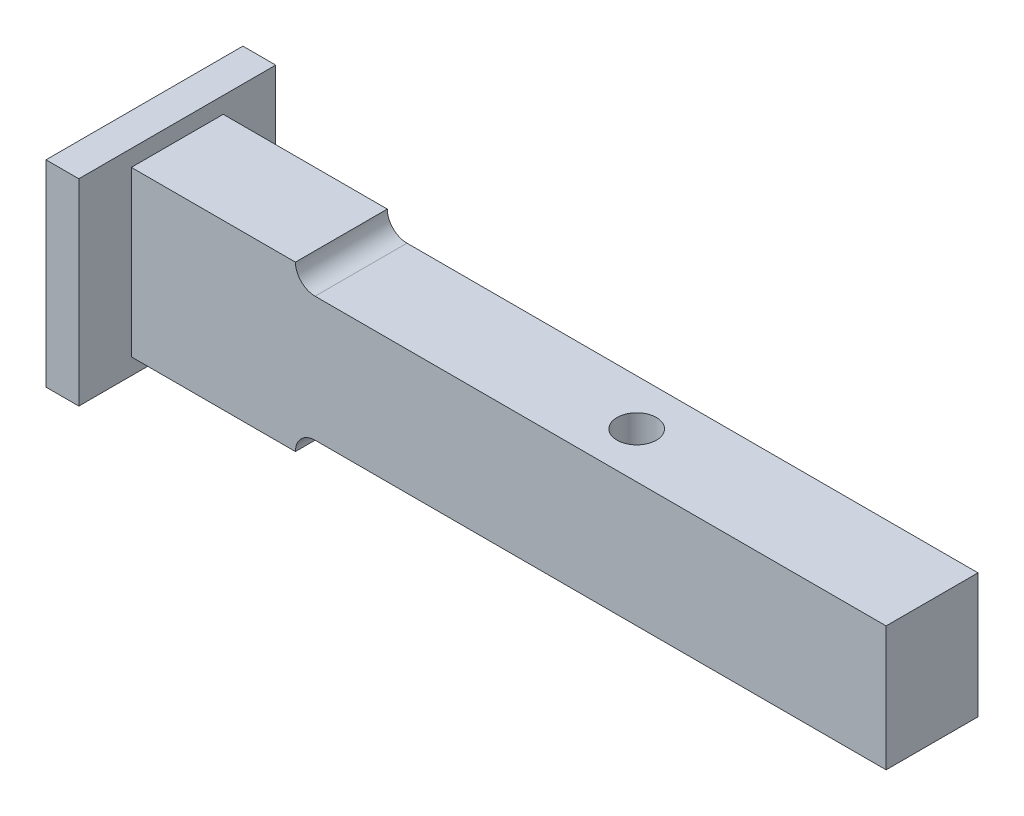
ISO-10303-21;
HEADER;
FILE_DESCRIPTION(('STEP AP214'),'2;1');
FILE_NAME('part.step','',(''),(''),'','','');
FILE_SCHEMA(('AUTOMOTIVE_DESIGN { 1 0 10303 214 1 1 1 1 }'));
ENDSEC;
DATA;
#1=APPLICATION_CONTEXT('core data for automotive mechanical design processes');
#2=APPLICATION_PROTOCOL_DEFINITION('international standard','automotive_design',2000,#1);
#3=PRODUCT_CONTEXT('',#1,'mechanical');
#4=PRODUCT('Part','Part','',(#3));
#5=PRODUCT_RELATED_PRODUCT_CATEGORY('part','',(#4));
#6=PRODUCT_DEFINITION_FORMATION('','',#4);
#7=PRODUCT_DEFINITION_CONTEXT('part definition',#1,'design');
#8=PRODUCT_DEFINITION('design','',#6,#7);
#9=PRODUCT_DEFINITION_SHAPE('','',#8);
#10=(LENGTH_UNIT() NAMED_UNIT(*) SI_UNIT(.MILLI.,.METRE.));
#11=(NAMED_UNIT(*) PLANE_ANGLE_UNIT() SI_UNIT($,.RADIAN.));
#12=(NAMED_UNIT(*) SI_UNIT($,.STERADIAN.) SOLID_ANGLE_UNIT());
#13=UNCERTAINTY_MEASURE_WITH_UNIT(LENGTH_MEASURE(1.E-05),#10,'distance_accuracy_value','');
#14=(GEOMETRIC_REPRESENTATION_CONTEXT(3) GLOBAL_UNCERTAINTY_ASSIGNED_CONTEXT((#13)) GLOBAL_UNIT_ASSIGNED_CONTEXT((#10,
#11,#12)) REPRESENTATION_CONTEXT('',''));
#15=CARTESIAN_POINT('',(0.,0.,0.));
#16=DIRECTION('',(0.,0.,1.));
#17=DIRECTION('',(1.,0.,0.));
#18=AXIS2_PLACEMENT_3D('',#15,#16,#17);
#19=CARTESIAN_POINT('',(0.,0.,0.));
#20=DIRECTION('',(1.,0.,0.));
#21=DIRECTION('',(0.,0.,-1.));
#22=AXIS2_PLACEMENT_3D('',#19,#20,#21);
#23=PLANE('',#22);
#24=DIRECTION('',(0.,0.,-1.));
#25=VECTOR('',#24,1.);
#26=CARTESIAN_POINT('',(0.,-30.,0.));
#27=LINE('',#26,#25);
#28=CARTESIAN_POINT('',(0.,-30.,30.));
#29=VERTEX_POINT('',#28);
#30=CARTESIAN_POINT('',(0.,-30.,-30.));
#31=VERTEX_POINT('',#30);
#32=EDGE_CURVE('E174',#29,#31,#27,.T.);
#33=ORIENTED_EDGE('',*,*,#32,.F.);
#34=DIRECTION('',(0.,1.,0.));
#35=VECTOR('',#34,1.);
#36=CARTESIAN_POINT('',(0.,0.,30.));
#37=LINE('',#36,#35);
#38=CARTESIAN_POINT('',(0.,30.,30.));
#39=VERTEX_POINT('',#38);
#40=EDGE_CURVE('E176',#29,#39,#37,.T.);
#41=ORIENTED_EDGE('',*,*,#40,.T.);
#42=DIRECTION('',(0.,0.,-1.));
#43=VECTOR('',#42,1.);
#44=CARTESIAN_POINT('',(0.,30.,0.));
#45=LINE('',#44,#43);
#46=CARTESIAN_POINT('',(0.,30.,-30.));
#47=VERTEX_POINT('',#46);
#48=EDGE_CURVE('E196',#39,#47,#45,.T.);
#49=ORIENTED_EDGE('',*,*,#48,.T.);
#50=DIRECTION('',(0.,1.,0.));
#51=VECTOR('',#50,1.);
#52=CARTESIAN_POINT('',(0.,0.,-30.));
#53=LINE('',#52,#51);
#54=EDGE_CURVE('E191',#31,#47,#53,.T.);
#55=ORIENTED_EDGE('',*,*,#54,.F.);
#56=EDGE_LOOP('',(#33,#41,#49,#55));
#57=FACE_BOUND('',#56,.T.);
#58=ADVANCED_FACE('F15',(#57),#23,.F.);
#59=CARTESIAN_POINT('',(10.,0.,-30.));
#60=DIRECTION('',(0.,0.,1.));
#61=DIRECTION('',(1.,0.,0.));
#62=AXIS2_PLACEMENT_3D('',#59,#60,#61);
#63=PLANE('',#62);
#64=ORIENTED_EDGE('',*,*,#54,.T.);
#65=DIRECTION('',(-1.,0.,0.));
#66=VECTOR('',#65,1.);
#67=CARTESIAN_POINT('',(10.,30.,-30.));
#68=LINE('',#67,#66);
#69=CARTESIAN_POINT('',(10.,30.,-30.));
#70=VERTEX_POINT('',#69);
#71=EDGE_CURVE('E209',#70,#47,#68,.T.);
#72=ORIENTED_EDGE('',*,*,#71,.F.);
#73=DIRECTION('',(0.,1.,0.));
#74=VECTOR('',#73,1.);
#75=CARTESIAN_POINT('',(10.,0.,-30.));
#76=LINE('',#75,#74);
#77=CARTESIAN_POINT('',(10.,-30.,-30.));
#78=VERTEX_POINT('',#77);
#79=EDGE_CURVE('E179',#78,#70,#76,.T.);
#80=ORIENTED_EDGE('',*,*,#79,.F.);
#81=DIRECTION('',(-1.,0.,0.));
#82=VECTOR('',#81,1.);
#83=CARTESIAN_POINT('',(10.,-30.,-30.));
#84=LINE('',#83,#82);
#85=EDGE_CURVE('E213',#78,#31,#84,.T.);
#86=ORIENTED_EDGE('',*,*,#85,.T.);
#87=EDGE_LOOP('',(#64,#72,#80,#86));
#88=FACE_BOUND('',#87,.T.);
#89=ADVANCED_FACE('F249',(#88),#63,.F.);
#90=CARTESIAN_POINT('',(10.,-30.,0.));
#91=DIRECTION('',(0.,1.,0.));
#92=DIRECTION('',(0.,0.,1.));
#93=AXIS2_PLACEMENT_3D('',#90,#91,#92);
#94=PLANE('',#93);
#95=ORIENTED_EDGE('',*,*,#32,.T.);
#96=ORIENTED_EDGE('',*,*,#85,.F.);
#97=DIRECTION('',(0.,0.,-1.));
#98=VECTOR('',#97,1.);
#99=CARTESIAN_POINT('',(10.,-30.,0.));
#100=LINE('',#99,#98);
#101=CARTESIAN_POINT('',(10.,-30.,30.));
#102=VERTEX_POINT('',#101);
#103=EDGE_CURVE('E173',#102,#78,#100,.T.);
#104=ORIENTED_EDGE('',*,*,#103,.F.);
#105=DIRECTION('',(-1.,0.,0.));
#106=VECTOR('',#105,1.);
#107=CARTESIAN_POINT('',(10.,-30.,30.));
#108=LINE('',#107,#106);
#109=EDGE_CURVE('E189',#102,#29,#108,.T.);
#110=ORIENTED_EDGE('',*,*,#109,.T.);
#111=EDGE_LOOP('',(#95,#96,#104,#110));
#112=FACE_BOUND('',#111,.T.);
#113=ADVANCED_FACE('F248',(#112),#94,.F.);
#114=CARTESIAN_POINT('',(10.,0.,30.));
#115=DIRECTION('',(0.,0.,1.));
#116=DIRECTION('',(1.,0.,0.));
#117=AXIS2_PLACEMENT_3D('',#114,#115,#116);
#118=PLANE('',#117);
#119=ORIENTED_EDGE('',*,*,#40,.F.);
#120=ORIENTED_EDGE('',*,*,#109,.F.);
#121=DIRECTION('',(0.,1.,0.));
#122=VECTOR('',#121,1.);
#123=CARTESIAN_POINT('',(10.,0.,30.));
#124=LINE('',#123,#122);
#125=CARTESIAN_POINT('',(10.,30.,30.));
#126=VERTEX_POINT('',#125);
#127=EDGE_CURVE('E186',#102,#126,#124,.T.);
#128=ORIENTED_EDGE('',*,*,#127,.T.);
#129=DIRECTION('',(-1.,0.,0.));
#130=VECTOR('',#129,1.);
#131=CARTESIAN_POINT('',(10.,30.,30.));
#132=LINE('',#131,#130);
#133=EDGE_CURVE('E210',#126,#39,#132,.T.);
#134=ORIENTED_EDGE('',*,*,#133,.T.);
#135=EDGE_LOOP('',(#119,#120,#128,#134));
#136=FACE_BOUND('',#135,.T.);
#137=ADVANCED_FACE('F256',(#136),#118,.T.);
#138=CARTESIAN_POINT('',(10.,30.,0.));
#139=DIRECTION('',(0.,1.,0.));
#140=DIRECTION('',(0.,0.,1.));
#141=AXIS2_PLACEMENT_3D('',#138,#139,#140);
#142=PLANE('',#141);
#143=ORIENTED_EDGE('',*,*,#48,.F.);
#144=ORIENTED_EDGE('',*,*,#133,.F.);
#145=DIRECTION('',(0.,0.,-1.));
#146=VECTOR('',#145,1.);
#147=CARTESIAN_POINT('',(10.,30.,0.));
#148=LINE('',#147,#146);
#149=EDGE_CURVE('E181',#126,#70,#148,.T.);
#150=ORIENTED_EDGE('',*,*,#149,.T.);
#151=ORIENTED_EDGE('',*,*,#71,.T.);
#152=EDGE_LOOP('',(#143,#144,#150,#151));
#153=FACE_BOUND('',#152,.T.);
#154=ADVANCED_FACE('F262',(#153),#142,.T.);
#155=CARTESIAN_POINT('',(10.,0.,0.));
#156=DIRECTION('',(1.,0.,0.));
#157=DIRECTION('',(0.,0.,-1.));
#158=AXIS2_PLACEMENT_3D('',#155,#156,#157);
#159=PLANE('',#158);
#160=DIRECTION('',(0.,1.,0.));
#161=VECTOR('',#160,1.);
#162=CARTESIAN_POINT('',(10.,-25.,-14.));
#163=LINE('',#162,#161);
#164=CARTESIAN_POINT('',(10.,-25.,-14.));
#165=VERTEX_POINT('',#164);
#166=CARTESIAN_POINT('',(10.,25.,-14.));
#167=VERTEX_POINT('',#166);
#168=EDGE_CURVE('E128',#165,#167,#163,.T.);
#169=ORIENTED_EDGE('',*,*,#168,.F.);
#170=DIRECTION('',(0.,0.,-1.));
#171=VECTOR('',#170,1.);
#172=CARTESIAN_POINT('',(10.,-25.,14.));
#173=LINE('',#172,#171);
#174=CARTESIAN_POINT('',(10.,-25.,14.));
#175=VERTEX_POINT('',#174);
#176=EDGE_CURVE('E141',#175,#165,#173,.T.);
#177=ORIENTED_EDGE('',*,*,#176,.F.);
#178=DIRECTION('',(0.,-1.,0.));
#179=VECTOR('',#178,1.);
#180=CARTESIAN_POINT('',(10.,-25.,14.));
#181=LINE('',#180,#179);
#182=CARTESIAN_POINT('',(10.,25.,14.));
#183=VERTEX_POINT('',#182);
#184=EDGE_CURVE('E151',#183,#175,#181,.T.);
#185=ORIENTED_EDGE('',*,*,#184,.F.);
#186=DIRECTION('',(0.,0.,1.));
#187=VECTOR('',#186,1.);
#188=CARTESIAN_POINT('',(10.,25.,14.));
#189=LINE('',#188,#187);
#190=EDGE_CURVE('E132',#167,#183,#189,.T.);
#191=ORIENTED_EDGE('',*,*,#190,.F.);
#192=EDGE_LOOP('',(#169,#177,#185,#191));
#193=FACE_BOUND('',#192,.T.);
#194=ORIENTED_EDGE('',*,*,#103,.T.);
#195=ORIENTED_EDGE('',*,*,#79,.T.);
#196=ORIENTED_EDGE('',*,*,#149,.F.);
#197=ORIENTED_EDGE('',*,*,#127,.F.);
#198=EDGE_LOOP('',(#194,#195,#196,#197));
#199=FACE_BOUND('',#198,.T.);
#200=ADVANCED_FACE('F270',(#193,#199),#159,.T.);
#201=CARTESIAN_POINT('',(60.,-25.,-14.));
#202=DIRECTION('',(0.,0.,1.));
#203=DIRECTION('',(1.,0.,0.));
#204=AXIS2_PLACEMENT_3D('',#201,#202,#203);
#205=PLANE('',#204);
#206=ORIENTED_EDGE('',*,*,#168,.T.);
#207=DIRECTION('',(-1.,0.,0.));
#208=VECTOR('',#207,1.);
#209=CARTESIAN_POINT('',(60.,25.,-14.));
#210=LINE('',#209,#208);
#211=CARTESIAN_POINT('',(60.,25.,-14.));
#212=VERTEX_POINT('',#211);
#213=EDGE_CURVE('E166',#212,#167,#210,.T.);
#214=ORIENTED_EDGE('',*,*,#213,.F.);
#215=CARTESIAN_POINT('',(66.,25.,-14.));
#216=DIRECTION('',(0.,0.,1.));
#217=DIRECTION('',(1.,0.,0.));
#218=AXIS2_PLACEMENT_3D('',#215,#216,#217);
#219=CIRCLE('',#218,6.);
#220=CARTESIAN_POINT('',(66.,19.,-14.));
#221=VERTEX_POINT('',#220);
#222=EDGE_CURVE('E9',#212,#221,#219,.T.);
#223=ORIENTED_EDGE('',*,*,#222,.T.);
#224=DIRECTION('',(-1.,0.,0.));
#225=VECTOR('',#224,1.);
#226=CARTESIAN_POINT('',(240.,19.,-14.));
#227=LINE('',#226,#225);
#228=CARTESIAN_POINT('',(240.,19.,-14.));
#229=VERTEX_POINT('',#228);
#230=EDGE_CURVE('E110',#229,#221,#227,.T.);
#231=ORIENTED_EDGE('',*,*,#230,.F.);
#232=DIRECTION('',(0.,1.,0.));
#233=VECTOR('',#232,1.);
#234=CARTESIAN_POINT('',(240.,-19.,-14.));
#235=LINE('',#234,#233);
#236=CARTESIAN_POINT('',(240.,-19.,-14.));
#237=VERTEX_POINT('',#236);
#238=EDGE_CURVE('E111',#237,#229,#235,.T.);
#239=ORIENTED_EDGE('',*,*,#238,.F.);
#240=DIRECTION('',(-1.,0.,0.));
#241=VECTOR('',#240,1.);
#242=CARTESIAN_POINT('',(240.,-19.,-14.));
#243=LINE('',#242,#241);
#244=CARTESIAN_POINT('',(66.,-19.,-14.));
#245=VERTEX_POINT('',#244);
#246=EDGE_CURVE('E306',#237,#245,#243,.T.);
#247=ORIENTED_EDGE('',*,*,#246,.T.);
#248=CARTESIAN_POINT('',(66.,-25.,-14.));
#249=DIRECTION('',(0.,0.,1.));
#250=DIRECTION('',(1.,0.,0.));
#251=AXIS2_PLACEMENT_3D('',#248,#249,#250);
#252=CIRCLE('',#251,6.);
#253=CARTESIAN_POINT('',(60.,-25.,-14.));
#254=VERTEX_POINT('',#253);
#255=EDGE_CURVE('E229',#245,#254,#252,.T.);
#256=ORIENTED_EDGE('',*,*,#255,.T.);
#257=DIRECTION('',(-1.,0.,0.));
#258=VECTOR('',#257,1.);
#259=CARTESIAN_POINT('',(60.,-25.,-14.));
#260=LINE('',#259,#258);
#261=EDGE_CURVE('E148',#254,#165,#260,.T.);
#262=ORIENTED_EDGE('',*,*,#261,.T.);
#263=EDGE_LOOP('',(#206,#214,#223,#231,#239,#247,#256,#262));
#264=FACE_BOUND('',#263,.T.);
#265=ADVANCED_FACE('F130',(#264),#205,.F.);
#266=CARTESIAN_POINT('',(60.,25.,14.));
#267=DIRECTION('',(0.,-1.,0.));
#268=DIRECTION('',(0.,0.,-1.));
#269=AXIS2_PLACEMENT_3D('',#266,#267,#268);
#270=PLANE('',#269);
#271=ORIENTED_EDGE('',*,*,#190,.T.);
#272=DIRECTION('',(-1.,0.,0.));
#273=VECTOR('',#272,1.);
#274=CARTESIAN_POINT('',(60.,25.,14.));
#275=LINE('',#274,#273);
#276=CARTESIAN_POINT('',(60.,25.,14.));
#277=VERTEX_POINT('',#276);
#278=EDGE_CURVE('E164',#277,#183,#275,.T.);
#279=ORIENTED_EDGE('',*,*,#278,.F.);
#280=DIRECTION('',(0.,0.,1.));
#281=VECTOR('',#280,1.);
#282=CARTESIAN_POINT('',(60.,25.,14.));
#283=LINE('',#282,#281);
#284=EDGE_CURVE('E136',#212,#277,#283,.T.);
#285=ORIENTED_EDGE('',*,*,#284,.F.);
#286=ORIENTED_EDGE('',*,*,#213,.T.);
#287=EDGE_LOOP('',(#271,#279,#285,#286));
#288=FACE_BOUND('',#287,.T.);
#289=ADVANCED_FACE('F238',(#288),#270,.F.);
#290=CARTESIAN_POINT('',(60.,-25.,14.));
#291=DIRECTION('',(0.,0.,-1.));
#292=DIRECTION('',(-1.,0.,0.));
#293=AXIS2_PLACEMENT_3D('',#290,#291,#292);
#294=PLANE('',#293);
#295=ORIENTED_EDGE('',*,*,#184,.T.);
#296=DIRECTION('',(-1.,0.,0.));
#297=VECTOR('',#296,1.);
#298=CARTESIAN_POINT('',(60.,-25.,14.));
#299=LINE('',#298,#297);
#300=CARTESIAN_POINT('',(60.,-25.,14.));
#301=VERTEX_POINT('',#300);
#302=EDGE_CURVE('E161',#301,#175,#299,.T.);
#303=ORIENTED_EDGE('',*,*,#302,.F.);
#304=CARTESIAN_POINT('',(66.,-25.,14.));
#305=DIRECTION('',(0.,0.,-1.));
#306=DIRECTION('',(-1.,0.,0.));
#307=AXIS2_PLACEMENT_3D('',#304,#305,#306);
#308=CIRCLE('',#307,6.);
#309=CARTESIAN_POINT('',(66.,-19.,14.));
#310=VERTEX_POINT('',#309);
#311=EDGE_CURVE('E232',#301,#310,#308,.T.);
#312=ORIENTED_EDGE('',*,*,#311,.T.);
#313=DIRECTION('',(-1.,0.,0.));
#314=VECTOR('',#313,1.);
#315=CARTESIAN_POINT('',(240.,-19.,14.));
#316=LINE('',#315,#314);
#317=CARTESIAN_POINT('',(240.,-19.,14.));
#318=VERTEX_POINT('',#317);
#319=EDGE_CURVE('E134',#318,#310,#316,.T.);
#320=ORIENTED_EDGE('',*,*,#319,.F.);
#321=DIRECTION('',(0.,-1.,0.));
#322=VECTOR('',#321,1.);
#323=CARTESIAN_POINT('',(240.,-19.,14.));
#324=LINE('',#323,#322);
#325=CARTESIAN_POINT('',(240.,19.,14.));
#326=VERTEX_POINT('',#325);
#327=EDGE_CURVE('E114',#326,#318,#324,.T.);
#328=ORIENTED_EDGE('',*,*,#327,.F.);
#329=DIRECTION('',(-1.,0.,0.));
#330=VECTOR('',#329,1.);
#331=CARTESIAN_POINT('',(240.,19.,14.));
#332=LINE('',#331,#330);
#333=CARTESIAN_POINT('',(66.,19.,14.));
#334=VERTEX_POINT('',#333);
#335=EDGE_CURVE('E108',#326,#334,#332,.T.);
#336=ORIENTED_EDGE('',*,*,#335,.T.);
#337=CARTESIAN_POINT('',(66.,25.,14.));
#338=DIRECTION('',(0.,0.,-1.));
#339=DIRECTION('',(-1.,0.,0.));
#340=AXIS2_PLACEMENT_3D('',#337,#338,#339);
#341=CIRCLE('',#340,6.);
#342=EDGE_CURVE('E24',#334,#277,#341,.T.);
#343=ORIENTED_EDGE('',*,*,#342,.T.);
#344=ORIENTED_EDGE('',*,*,#278,.T.);
#345=EDGE_LOOP('',(#295,#303,#312,#320,#328,#336,#343,#344));
#346=FACE_BOUND('',#345,.T.);
#347=ADVANCED_FACE('F240',(#346),#294,.F.);
#348=CARTESIAN_POINT('',(60.,-25.,14.));
#349=DIRECTION('',(0.,1.,0.));
#350=DIRECTION('',(0.,0.,1.));
#351=AXIS2_PLACEMENT_3D('',#348,#349,#350);
#352=PLANE('',#351);
#353=ORIENTED_EDGE('',*,*,#176,.T.);
#354=ORIENTED_EDGE('',*,*,#261,.F.);
#355=DIRECTION('',(0.,0.,-1.));
#356=VECTOR('',#355,1.);
#357=CARTESIAN_POINT('',(60.,-25.,14.));
#358=LINE('',#357,#356);
#359=EDGE_CURVE('E142',#301,#254,#358,.T.);
#360=ORIENTED_EDGE('',*,*,#359,.F.);
#361=ORIENTED_EDGE('',*,*,#302,.T.);
#362=EDGE_LOOP('',(#353,#354,#360,#361));
#363=FACE_BOUND('',#362,.T.);
#364=ADVANCED_FACE('F281',(#363),#352,.F.);
#365=CARTESIAN_POINT('',(240.,19.,14.));
#366=DIRECTION('',(0.,-1.,0.));
#367=DIRECTION('',(0.,0.,-1.));
#368=AXIS2_PLACEMENT_3D('',#365,#366,#367);
#369=PLANE('',#368);
#370=CARTESIAN_POINT('',(150.,19.,0.));
#371=DIRECTION('',(0.,1.,0.));
#372=DIRECTION('',(0.,0.,1.));
#373=AXIS2_PLACEMENT_3D('',#370,#371,#372);
#374=CIRCLE('',#373,6.);
#375=CARTESIAN_POINT('',(150.,19.,6.00000000000001));
#376=VERTEX_POINT('',#375);
#377=EDGE_CURVE('E222',#376,#376,#374,.T.);
#378=ORIENTED_EDGE('',*,*,#377,.F.);
#379=EDGE_LOOP('',(#378));
#380=FACE_BOUND('',#379,.T.);
#381=ORIENTED_EDGE('',*,*,#230,.T.);
#382=DIRECTION('',(0.,0.,1.));
#383=VECTOR('',#382,1.);
#384=CARTESIAN_POINT('',(66.,19.,14.));
#385=LINE('',#384,#383);
#386=EDGE_CURVE('E223',#221,#334,#385,.T.);
#387=ORIENTED_EDGE('',*,*,#386,.T.);
#388=ORIENTED_EDGE('',*,*,#335,.F.);
#389=DIRECTION('',(0.,0.,1.));
#390=VECTOR('',#389,1.);
#391=CARTESIAN_POINT('',(240.,19.,14.));
#392=LINE('',#391,#390);
#393=EDGE_CURVE('E102',#229,#326,#392,.T.);
#394=ORIENTED_EDGE('',*,*,#393,.F.);
#395=EDGE_LOOP('',(#381,#387,#388,#394));
#396=FACE_BOUND('',#395,.T.);
#397=ADVANCED_FACE('F106',(#380,#396),#369,.F.);
#398=CARTESIAN_POINT('',(240.,-19.,14.));
#399=DIRECTION('',(0.,1.,0.));
#400=DIRECTION('',(0.,0.,1.));
#401=AXIS2_PLACEMENT_3D('',#398,#399,#400);
#402=PLANE('',#401);
#403=CARTESIAN_POINT('',(150.,-19.,0.));
#404=DIRECTION('',(0.,1.,0.));
#405=DIRECTION('',(0.,0.,1.));
#406=AXIS2_PLACEMENT_3D('',#403,#404,#405);
#407=CIRCLE('',#406,6.);
#408=CARTESIAN_POINT('',(150.,-19.,6.00000000000001));
#409=VERTEX_POINT('',#408);
#410=EDGE_CURVE('E124',#409,#409,#407,.T.);
#411=ORIENTED_EDGE('',*,*,#410,.T.);
#412=EDGE_LOOP('',(#411));
#413=FACE_BOUND('',#412,.T.);
#414=ORIENTED_EDGE('',*,*,#319,.T.);
#415=DIRECTION('',(0.,0.,-1.));
#416=VECTOR('',#415,1.);
#417=CARTESIAN_POINT('',(66.,-19.,-14.));
#418=LINE('',#417,#416);
#419=EDGE_CURVE('E220',#310,#245,#418,.T.);
#420=ORIENTED_EDGE('',*,*,#419,.T.);
#421=ORIENTED_EDGE('',*,*,#246,.F.);
#422=DIRECTION('',(0.,0.,-1.));
#423=VECTOR('',#422,1.);
#424=CARTESIAN_POINT('',(240.,-19.,14.));
#425=LINE('',#424,#423);
#426=EDGE_CURVE('E118',#318,#237,#425,.T.);
#427=ORIENTED_EDGE('',*,*,#426,.F.);
#428=EDGE_LOOP('',(#414,#420,#421,#427));
#429=FACE_BOUND('',#428,.T.);
#430=ADVANCED_FACE('F290',(#413,#429),#402,.F.);
#431=CARTESIAN_POINT('',(240.,0.,0.));
#432=DIRECTION('',(-1.,0.,0.));
#433=DIRECTION('',(0.,0.,1.));
#434=AXIS2_PLACEMENT_3D('',#431,#432,#433);
#435=PLANE('',#434);
#436=ORIENTED_EDGE('',*,*,#238,.T.);
#437=ORIENTED_EDGE('',*,*,#393,.T.);
#438=ORIENTED_EDGE('',*,*,#327,.T.);
#439=ORIENTED_EDGE('',*,*,#426,.T.);
#440=EDGE_LOOP('',(#436,#437,#438,#439));
#441=FACE_BOUND('',#440,.T.);
#442=ADVANCED_FACE('F117',(#441),#435,.F.);
#443=CARTESIAN_POINT('',(150.,-161.,0.));
#444=DIRECTION('',(0.,1.,0.));
#445=DIRECTION('',(0.,0.,1.));
#446=AXIS2_PLACEMENT_3D('',#443,#444,#445);
#447=CYLINDRICAL_SURFACE('',#446,6.);
#448=ORIENTED_EDGE('',*,*,#377,.T.);
#449=EDGE_LOOP('',(#448));
#450=FACE_BOUND('',#449,.T.);
#451=ORIENTED_EDGE('',*,*,#410,.F.);
#452=EDGE_LOOP('',(#451));
#453=FACE_BOUND('',#452,.T.);
#454=ADVANCED_FACE('F247',(#450,#453),#447,.F.);
#455=CARTESIAN_POINT('',(66.,-25.,14.));
#456=DIRECTION('',(0.,0.,1.));
#457=DIRECTION('',(1.,0.,0.));
#458=AXIS2_PLACEMENT_3D('',#455,#456,#457);
#459=CYLINDRICAL_SURFACE('',#458,6.);
#460=ORIENTED_EDGE('',*,*,#311,.F.);
#461=ORIENTED_EDGE('',*,*,#359,.T.);
#462=ORIENTED_EDGE('',*,*,#255,.F.);
#463=ORIENTED_EDGE('',*,*,#419,.F.);
#464=EDGE_LOOP('',(#460,#461,#462,#463));
#465=FACE_BOUND('',#464,.T.);
#466=ADVANCED_FACE('F239',(#465),#459,.F.);
#467=CARTESIAN_POINT('',(66.,25.,14.));
#468=DIRECTION('',(0.,0.,-1.));
#469=DIRECTION('',(-1.,0.,0.));
#470=AXIS2_PLACEMENT_3D('',#467,#468,#469);
#471=CYLINDRICAL_SURFACE('',#470,6.);
#472=ORIENTED_EDGE('',*,*,#222,.F.);
#473=ORIENTED_EDGE('',*,*,#284,.T.);
#474=ORIENTED_EDGE('',*,*,#342,.F.);
#475=ORIENTED_EDGE('',*,*,#386,.F.);
#476=EDGE_LOOP('',(#472,#473,#474,#475));
#477=FACE_BOUND('',#476,.T.);
#478=ADVANCED_FACE('F17',(#477),#471,.F.);
#479=CLOSED_SHELL('',(#58,#89,#113,#137,#154,#200,#265,#289,#347,#364,#397,#430,#442,#454,#466,#478));
#480=MANIFOLD_SOLID_BREP('B1',#479);
#481=ADVANCED_BREP_SHAPE_REPRESENTATION('',(#18,#480),#14);
#482=SHAPE_DEFINITION_REPRESENTATION(#9,#481);
ENDSEC;
END-ISO-10303-21;
